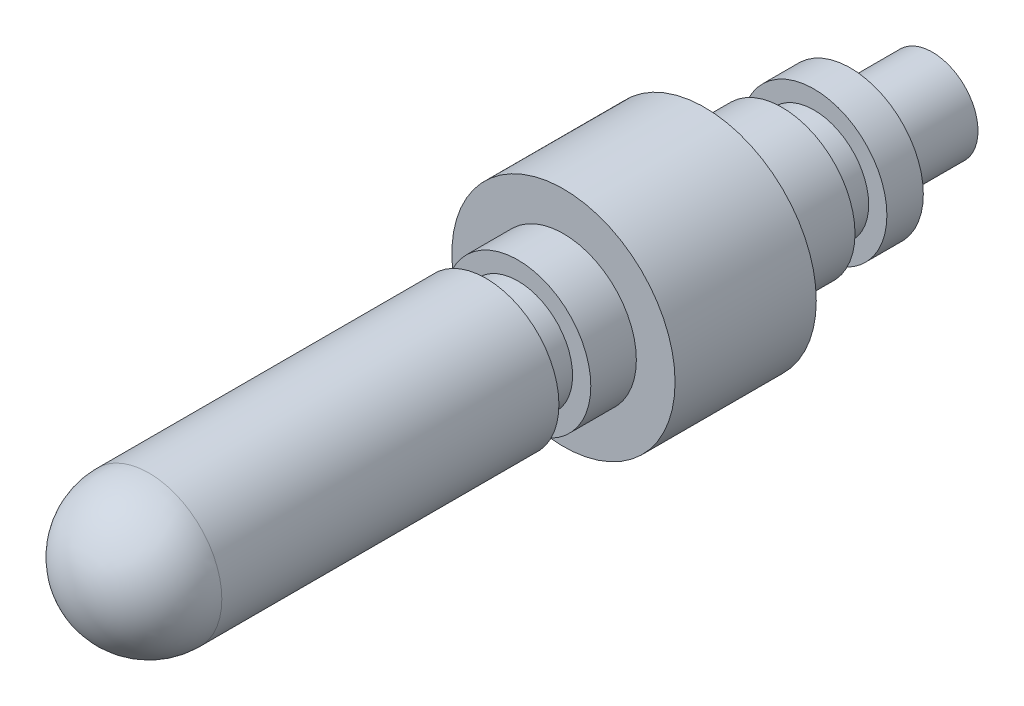
ISO-10303-21;
HEADER;
FILE_DESCRIPTION(('STEP AP214'),'2;1');
FILE_NAME('part.step','',(''),(''),'','','');
FILE_SCHEMA(('AUTOMOTIVE_DESIGN { 1 0 10303 214 1 1 1 1 }'));
ENDSEC;
DATA;
#1=APPLICATION_CONTEXT('core data for automotive mechanical design processes');
#2=APPLICATION_PROTOCOL_DEFINITION('international standard','automotive_design',2000,#1);
#3=PRODUCT_CONTEXT('',#1,'mechanical');
#4=PRODUCT('Part','Part','',(#3));
#5=PRODUCT_RELATED_PRODUCT_CATEGORY('part','',(#4));
#6=PRODUCT_DEFINITION_FORMATION('','',#4);
#7=PRODUCT_DEFINITION_CONTEXT('part definition',#1,'design');
#8=PRODUCT_DEFINITION('design','',#6,#7);
#9=PRODUCT_DEFINITION_SHAPE('','',#8);
#10=(LENGTH_UNIT() NAMED_UNIT(*) SI_UNIT(.MILLI.,.METRE.));
#11=(NAMED_UNIT(*) PLANE_ANGLE_UNIT() SI_UNIT($,.RADIAN.));
#12=(NAMED_UNIT(*) SI_UNIT($,.STERADIAN.) SOLID_ANGLE_UNIT());
#13=UNCERTAINTY_MEASURE_WITH_UNIT(LENGTH_MEASURE(1.E-05),#10,'distance_accuracy_value','');
#14=(GEOMETRIC_REPRESENTATION_CONTEXT(3) GLOBAL_UNCERTAINTY_ASSIGNED_CONTEXT((#13)) GLOBAL_UNIT_ASSIGNED_CONTEXT((#10,
#11,#12)) REPRESENTATION_CONTEXT('',''));
#15=CARTESIAN_POINT('',(0.,0.,0.));
#16=DIRECTION('',(0.,0.,1.));
#17=DIRECTION('',(1.,0.,0.));
#18=AXIS2_PLACEMENT_3D('',#15,#16,#17);
#19=CARTESIAN_POINT('',(0.,0.,11.557));
#20=DIRECTION('',(0.,0.,1.));
#21=DIRECTION('',(1.,0.,0.));
#22=AXIS2_PLACEMENT_3D('',#19,#20,#21);
#23=PLANE('',#22);
#24=CARTESIAN_POINT('',(0.,0.,11.557));
#25=DIRECTION('',(0.,0.,1.));
#26=DIRECTION('',(1.,0.,0.));
#27=AXIS2_PLACEMENT_3D('',#24,#25,#26);
#28=CIRCLE('',#27,2.032);
#29=CARTESIAN_POINT('',(2.032,0.,11.557));
#30=VERTEX_POINT('',#29);
#31=EDGE_CURVE('E69',#30,#30,#28,.T.);
#32=ORIENTED_EDGE('',*,*,#31,.T.);
#33=EDGE_LOOP('',(#32));
#34=FACE_BOUND('',#33,.T.);
#35=CARTESIAN_POINT('',(0.,0.,11.557));
#36=DIRECTION('',(0.,0.,1.));
#37=DIRECTION('',(1.,0.,0.));
#38=AXIS2_PLACEMENT_3D('',#35,#36,#37);
#39=CIRCLE('',#38,1.524);
#40=CARTESIAN_POINT('',(1.524,0.,11.557));
#41=VERTEX_POINT('',#40);
#42=EDGE_CURVE('E78',#41,#41,#39,.T.);
#43=ORIENTED_EDGE('',*,*,#42,.F.);
#44=EDGE_LOOP('',(#43));
#45=FACE_BOUND('',#44,.T.);
#46=ADVANCED_FACE('F30',(#34,#45),#23,.T.);
#47=CARTESIAN_POINT('',(0.,0.,10.287));
#48=DIRECTION('',(0.,0.,1.));
#49=DIRECTION('',(1.,0.,0.));
#50=AXIS2_PLACEMENT_3D('',#47,#48,#49);
#51=PLANE('',#50);
#52=CARTESIAN_POINT('',(0.,0.,10.287));
#53=DIRECTION('',(0.,0.,1.));
#54=DIRECTION('',(1.,0.,0.));
#55=AXIS2_PLACEMENT_3D('',#52,#53,#54);
#56=CIRCLE('',#55,3.1115);
#57=CARTESIAN_POINT('',(3.1115,0.,10.287));
#58=VERTEX_POINT('',#57);
#59=EDGE_CURVE('E63',#58,#58,#56,.T.);
#60=ORIENTED_EDGE('',*,*,#59,.T.);
#61=EDGE_LOOP('',(#60));
#62=FACE_BOUND('',#61,.T.);
#63=CARTESIAN_POINT('',(0.,0.,10.287));
#64=DIRECTION('',(0.,0.,1.));
#65=DIRECTION('',(1.,0.,0.));
#66=AXIS2_PLACEMENT_3D('',#63,#64,#65);
#67=CIRCLE('',#66,2.032);
#68=CARTESIAN_POINT('',(2.032,0.,10.287));
#69=VERTEX_POINT('',#68);
#70=EDGE_CURVE('E72',#69,#69,#67,.T.);
#71=ORIENTED_EDGE('',*,*,#70,.F.);
#72=EDGE_LOOP('',(#71));
#73=FACE_BOUND('',#72,.T.);
#74=ADVANCED_FACE('F103',(#62,#73),#51,.T.);
#75=CARTESIAN_POINT('',(0.,0.,3.302));
#76=DIRECTION('',(0.,0.,1.));
#77=DIRECTION('',(1.,0.,0.));
#78=AXIS2_PLACEMENT_3D('',#75,#76,#77);
#79=PLANE('',#78);
#80=CARTESIAN_POINT('',(0.,0.,3.302));
#81=DIRECTION('',(0.,0.,1.));
#82=DIRECTION('',(1.,0.,0.));
#83=AXIS2_PLACEMENT_3D('',#80,#81,#82);
#84=CIRCLE('',#83,2.032);
#85=CARTESIAN_POINT('',(2.032,0.,3.302));
#86=VERTEX_POINT('',#85);
#87=EDGE_CURVE('E46',#86,#86,#84,.T.);
#88=ORIENTED_EDGE('',*,*,#87,.T.);
#89=EDGE_LOOP('',(#88));
#90=FACE_BOUND('',#89,.T.);
#91=CARTESIAN_POINT('',(0.,0.,3.302));
#92=DIRECTION('',(0.,0.,1.));
#93=DIRECTION('',(1.,0.,0.));
#94=AXIS2_PLACEMENT_3D('',#91,#92,#93);
#95=CIRCLE('',#94,1.524);
#96=CARTESIAN_POINT('',(1.524,0.,3.302));
#97=VERTEX_POINT('',#96);
#98=EDGE_CURVE('E54',#97,#97,#95,.T.);
#99=ORIENTED_EDGE('',*,*,#98,.F.);
#100=EDGE_LOOP('',(#99));
#101=FACE_BOUND('',#100,.T.);
#102=ADVANCED_FACE('F109',(#90,#101),#79,.T.);
#103=CARTESIAN_POINT('',(0.,0.,2.286));
#104=DIRECTION('',(0.,0.,-1.));
#105=DIRECTION('',(-1.,0.,0.));
#106=AXIS2_PLACEMENT_3D('',#103,#104,#105);
#107=CYLINDRICAL_SURFACE('',#106,1.27);
#108=CARTESIAN_POINT('',(0.,0.,2.286));
#109=DIRECTION('',(0.,0.,1.));
#110=DIRECTION('',(1.,0.,0.));
#111=AXIS2_PLACEMENT_3D('',#108,#109,#110);
#112=CIRCLE('',#111,1.27);
#113=CARTESIAN_POINT('',(1.27,0.,2.286));
#114=VERTEX_POINT('',#113);
#115=EDGE_CURVE('E37',#114,#114,#112,.T.);
#116=ORIENTED_EDGE('',*,*,#115,.F.);
#117=EDGE_LOOP('',(#116));
#118=FACE_BOUND('',#117,.T.);
#119=CARTESIAN_POINT('',(0.,0.,0.));
#120=DIRECTION('',(0.,0.,1.));
#121=DIRECTION('',(1.,0.,0.));
#122=AXIS2_PLACEMENT_3D('',#119,#120,#121);
#123=CIRCLE('',#122,1.27);
#124=CARTESIAN_POINT('',(1.27,0.,0.));
#125=VERTEX_POINT('',#124);
#126=EDGE_CURVE('E41',#125,#125,#123,.T.);
#127=ORIENTED_EDGE('',*,*,#126,.T.);
#128=EDGE_LOOP('',(#127));
#129=FACE_BOUND('',#128,.T.);
#130=ADVANCED_FACE('F140',(#118,#129),#107,.T.);
#131=CARTESIAN_POINT('',(0.,0.,0.));
#132=DIRECTION('',(0.,0.,1.));
#133=DIRECTION('',(1.,0.,0.));
#134=AXIS2_PLACEMENT_3D('',#131,#132,#133);
#135=PLANE('',#134);
#136=ORIENTED_EDGE('',*,*,#126,.F.);
#137=EDGE_LOOP('',(#136));
#138=FACE_BOUND('',#137,.T.);
#139=ADVANCED_FACE('F145',(#138),#135,.F.);
#140=CARTESIAN_POINT('',(0.,0.,2.286));
#141=DIRECTION('',(0.,0.,1.));
#142=DIRECTION('',(1.,0.,0.));
#143=AXIS2_PLACEMENT_3D('',#140,#141,#142);
#144=PLANE('',#143);
#145=CARTESIAN_POINT('',(0.,0.,2.286));
#146=DIRECTION('',(0.,0.,1.));
#147=DIRECTION('',(1.,0.,0.));
#148=AXIS2_PLACEMENT_3D('',#145,#146,#147);
#149=CIRCLE('',#148,2.032);
#150=CARTESIAN_POINT('',(2.032,0.,2.286));
#151=VERTEX_POINT('',#150);
#152=EDGE_CURVE('E48',#151,#151,#149,.T.);
#153=ORIENTED_EDGE('',*,*,#152,.F.);
#154=EDGE_LOOP('',(#153));
#155=FACE_BOUND('',#154,.T.);
#156=ORIENTED_EDGE('',*,*,#115,.T.);
#157=EDGE_LOOP('',(#156));
#158=FACE_BOUND('',#157,.T.);
#159=ADVANCED_FACE('F142',(#155,#158),#144,.F.);
#160=CARTESIAN_POINT('',(0.,0.,3.302));
#161=DIRECTION('',(0.,0.,-1.));
#162=DIRECTION('',(-1.,0.,0.));
#163=AXIS2_PLACEMENT_3D('',#160,#161,#162);
#164=CYLINDRICAL_SURFACE('',#163,2.032);
#165=ORIENTED_EDGE('',*,*,#87,.F.);
#166=EDGE_LOOP('',(#165));
#167=FACE_BOUND('',#166,.T.);
#168=ORIENTED_EDGE('',*,*,#152,.T.);
#169=EDGE_LOOP('',(#168));
#170=FACE_BOUND('',#169,.T.);
#171=ADVANCED_FACE('F136',(#167,#170),#164,.T.);
#172=CARTESIAN_POINT('',(0.,0.,4.191));
#173=DIRECTION('',(0.,0.,-1.));
#174=DIRECTION('',(-1.,0.,0.));
#175=AXIS2_PLACEMENT_3D('',#172,#173,#174);
#176=CYLINDRICAL_SURFACE('',#175,1.524);
#177=CARTESIAN_POINT('',(0.,0.,4.191));
#178=DIRECTION('',(0.,0.,1.));
#179=DIRECTION('',(1.,0.,0.));
#180=AXIS2_PLACEMENT_3D('',#177,#178,#179);
#181=CIRCLE('',#180,1.524);
#182=CARTESIAN_POINT('',(1.524,0.,4.191));
#183=VERTEX_POINT('',#182);
#184=EDGE_CURVE('E51',#183,#183,#181,.T.);
#185=ORIENTED_EDGE('',*,*,#184,.F.);
#186=EDGE_LOOP('',(#185));
#187=FACE_BOUND('',#186,.T.);
#188=ORIENTED_EDGE('',*,*,#98,.T.);
#189=EDGE_LOOP('',(#188));
#190=FACE_BOUND('',#189,.T.);
#191=ADVANCED_FACE('F129',(#187,#190),#176,.T.);
#192=CARTESIAN_POINT('',(0.,0.,4.191));
#193=DIRECTION('',(0.,0.,1.));
#194=DIRECTION('',(1.,0.,0.));
#195=AXIS2_PLACEMENT_3D('',#192,#193,#194);
#196=PLANE('',#195);
#197=CARTESIAN_POINT('',(0.,0.,4.191));
#198=DIRECTION('',(0.,0.,1.));
#199=DIRECTION('',(1.,0.,0.));
#200=AXIS2_PLACEMENT_3D('',#197,#198,#199);
#201=CIRCLE('',#200,2.032);
#202=CARTESIAN_POINT('',(2.032,0.,4.191));
#203=VERTEX_POINT('',#202);
#204=EDGE_CURVE('E60',#203,#203,#201,.T.);
#205=ORIENTED_EDGE('',*,*,#204,.F.);
#206=EDGE_LOOP('',(#205));
#207=FACE_BOUND('',#206,.T.);
#208=ORIENTED_EDGE('',*,*,#184,.T.);
#209=EDGE_LOOP('',(#208));
#210=FACE_BOUND('',#209,.T.);
#211=ADVANCED_FACE('F126',(#207,#210),#196,.F.);
#212=CARTESIAN_POINT('',(0.,0.,6.35));
#213=DIRECTION('',(0.,0.,-1.));
#214=DIRECTION('',(-1.,0.,0.));
#215=AXIS2_PLACEMENT_3D('',#212,#213,#214);
#216=CYLINDRICAL_SURFACE('',#215,2.032);
#217=CARTESIAN_POINT('',(0.,0.,6.35));
#218=DIRECTION('',(0.,0.,1.));
#219=DIRECTION('',(1.,0.,0.));
#220=AXIS2_PLACEMENT_3D('',#217,#218,#219);
#221=CIRCLE('',#220,2.032);
#222=CARTESIAN_POINT('',(2.032,0.,6.35));
#223=VERTEX_POINT('',#222);
#224=EDGE_CURVE('E57',#223,#223,#221,.T.);
#225=ORIENTED_EDGE('',*,*,#224,.F.);
#226=EDGE_LOOP('',(#225));
#227=FACE_BOUND('',#226,.T.);
#228=ORIENTED_EDGE('',*,*,#204,.T.);
#229=EDGE_LOOP('',(#228));
#230=FACE_BOUND('',#229,.T.);
#231=ADVANCED_FACE('F121',(#227,#230),#216,.T.);
#232=CARTESIAN_POINT('',(0.,0.,6.35));
#233=DIRECTION('',(0.,0.,1.));
#234=DIRECTION('',(1.,0.,0.));
#235=AXIS2_PLACEMENT_3D('',#232,#233,#234);
#236=PLANE('',#235);
#237=CARTESIAN_POINT('',(0.,0.,6.35));
#238=DIRECTION('',(0.,0.,1.));
#239=DIRECTION('',(1.,0.,0.));
#240=AXIS2_PLACEMENT_3D('',#237,#238,#239);
#241=CIRCLE('',#240,3.1115);
#242=CARTESIAN_POINT('',(3.1115,0.,6.35));
#243=VERTEX_POINT('',#242);
#244=EDGE_CURVE('E66',#243,#243,#241,.T.);
#245=ORIENTED_EDGE('',*,*,#244,.F.);
#246=EDGE_LOOP('',(#245));
#247=FACE_BOUND('',#246,.T.);
#248=ORIENTED_EDGE('',*,*,#224,.T.);
#249=EDGE_LOOP('',(#248));
#250=FACE_BOUND('',#249,.T.);
#251=ADVANCED_FACE('F118',(#247,#250),#236,.F.);
#252=CARTESIAN_POINT('',(0.,0.,10.287));
#253=DIRECTION('',(0.,0.,-1.));
#254=DIRECTION('',(-1.,0.,0.));
#255=AXIS2_PLACEMENT_3D('',#252,#253,#254);
#256=CYLINDRICAL_SURFACE('',#255,3.1115);
#257=ORIENTED_EDGE('',*,*,#59,.F.);
#258=EDGE_LOOP('',(#257));
#259=FACE_BOUND('',#258,.T.);
#260=ORIENTED_EDGE('',*,*,#244,.T.);
#261=EDGE_LOOP('',(#260));
#262=FACE_BOUND('',#261,.T.);
#263=ADVANCED_FACE('F115',(#259,#262),#256,.T.);
#264=CARTESIAN_POINT('',(0.,0.,11.557));
#265=DIRECTION('',(0.,0.,-1.));
#266=DIRECTION('',(-1.,0.,0.));
#267=AXIS2_PLACEMENT_3D('',#264,#265,#266);
#268=CYLINDRICAL_SURFACE('',#267,2.032);
#269=ORIENTED_EDGE('',*,*,#31,.F.);
#270=EDGE_LOOP('',(#269));
#271=FACE_BOUND('',#270,.T.);
#272=ORIENTED_EDGE('',*,*,#70,.T.);
#273=EDGE_LOOP('',(#272));
#274=FACE_BOUND('',#273,.T.);
#275=ADVANCED_FACE('F98',(#271,#274),#268,.T.);
#276=CARTESIAN_POINT('',(0.,0.,12.446));
#277=DIRECTION('',(0.,0.,-1.));
#278=DIRECTION('',(-1.,0.,0.));
#279=AXIS2_PLACEMENT_3D('',#276,#277,#278);
#280=CYLINDRICAL_SURFACE('',#279,1.524);
#281=CARTESIAN_POINT('',(0.,0.,12.446));
#282=DIRECTION('',(0.,0.,1.));
#283=DIRECTION('',(1.,0.,0.));
#284=AXIS2_PLACEMENT_3D('',#281,#282,#283);
#285=CIRCLE('',#284,1.524);
#286=CARTESIAN_POINT('',(1.524,0.,12.446));
#287=VERTEX_POINT('',#286);
#288=EDGE_CURVE('E75',#287,#287,#285,.T.);
#289=ORIENTED_EDGE('',*,*,#288,.F.);
#290=EDGE_LOOP('',(#289));
#291=FACE_BOUND('',#290,.T.);
#292=ORIENTED_EDGE('',*,*,#42,.T.);
#293=EDGE_LOOP('',(#292));
#294=FACE_BOUND('',#293,.T.);
#295=ADVANCED_FACE('F92',(#291,#294),#280,.T.);
#296=CARTESIAN_POINT('',(0.,0.,12.446));
#297=DIRECTION('',(0.,0.,1.));
#298=DIRECTION('',(1.,0.,0.));
#299=AXIS2_PLACEMENT_3D('',#296,#297,#298);
#300=PLANE('',#299);
#301=CARTESIAN_POINT('',(0.,0.,12.446));
#302=DIRECTION('',(0.,0.,1.));
#303=DIRECTION('',(1.,0.,0.));
#304=AXIS2_PLACEMENT_3D('',#301,#302,#303);
#305=CIRCLE('',#304,2.032);
#306=CARTESIAN_POINT('',(2.032,0.,12.446));
#307=VERTEX_POINT('',#306);
#308=EDGE_CURVE('E81',#307,#307,#305,.T.);
#309=ORIENTED_EDGE('',*,*,#308,.F.);
#310=EDGE_LOOP('',(#309));
#311=FACE_BOUND('',#310,.T.);
#312=ORIENTED_EDGE('',*,*,#288,.T.);
#313=EDGE_LOOP('',(#312));
#314=FACE_BOUND('',#313,.T.);
#315=ADVANCED_FACE('F89',(#311,#314),#300,.F.);
#316=CARTESIAN_POINT('',(0.,0.,23.876));
#317=DIRECTION('',(0.,0.,-1.));
#318=DIRECTION('',(-1.,0.,0.));
#319=AXIS2_PLACEMENT_3D('',#316,#317,#318);
#320=CYLINDRICAL_SURFACE('',#319,2.032);
#321=CARTESIAN_POINT('',(0.,0.,21.844));
#322=DIRECTION('',(0.,0.,-1.));
#323=DIRECTION('',(-1.,0.,0.));
#324=AXIS2_PLACEMENT_3D('',#321,#322,#323);
#325=CIRCLE('',#324,2.032);
#326=CARTESIAN_POINT('',(-2.032,0.,21.844));
#327=VERTEX_POINT('',#326);
#328=EDGE_CURVE('E10',#327,#327,#325,.T.);
#329=ORIENTED_EDGE('',*,*,#328,.T.);
#330=EDGE_LOOP('',(#329));
#331=FACE_BOUND('',#330,.T.);
#332=ORIENTED_EDGE('',*,*,#308,.T.);
#333=EDGE_LOOP('',(#332));
#334=FACE_BOUND('',#333,.T.);
#335=ADVANCED_FACE('F87',(#331,#334),#320,.T.);
#336=CARTESIAN_POINT('',(0.,0.,21.844));
#337=DIRECTION('',(0.,0.,1.));
#338=DIRECTION('',(1.,0.,0.));
#339=AXIS2_PLACEMENT_3D('',#336,#337,#338);
#340=SPHERICAL_SURFACE('',#339,2.032);
#341=ORIENTED_EDGE('',*,*,#328,.F.);
#342=EDGE_LOOP('',(#341));
#343=FACE_BOUND('',#342,.T.);
#344=ADVANCED_FACE('F32',(#343),#340,.T.);
#345=CLOSED_SHELL('',(#46,#74,#102,#130,#139,#159,#171,#191,#211,#231,#251,#263,#275,#295,#315,
#335,#344));
#346=MANIFOLD_SOLID_BREP('B2',#345);
#347=ADVANCED_BREP_SHAPE_REPRESENTATION('',(#18,#346),#14);
#348=SHAPE_DEFINITION_REPRESENTATION(#9,#347);
ENDSEC;
END-ISO-10303-21;
